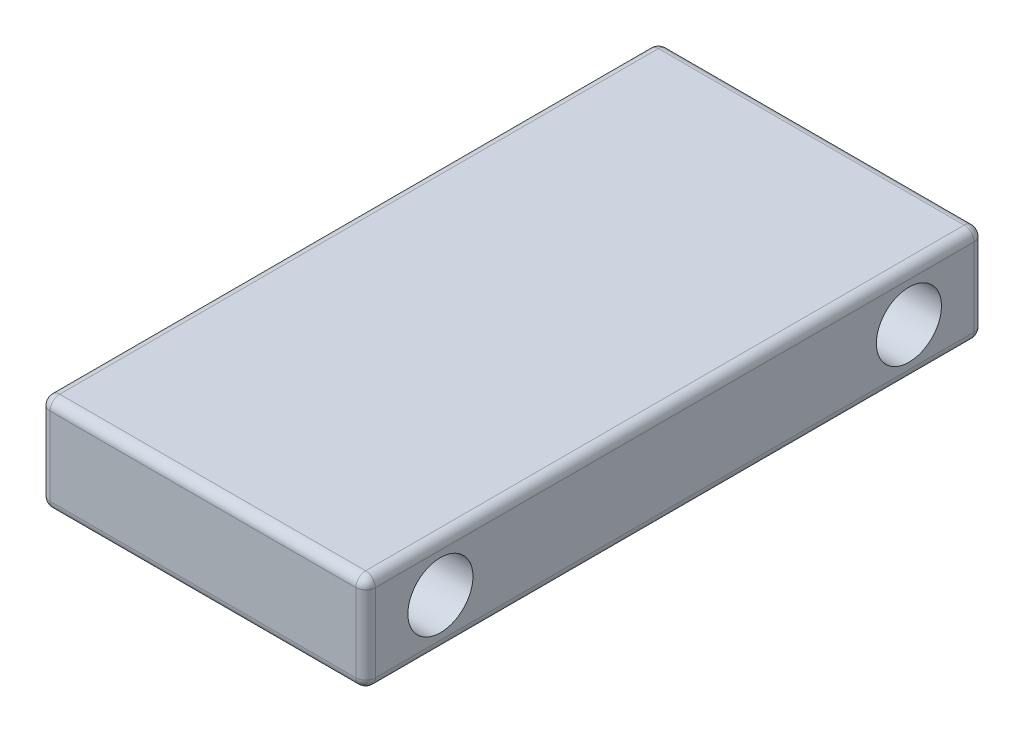
ISO-10303-21;
HEADER;
FILE_DESCRIPTION(('STEP AP214'),'2;1');
FILE_NAME('part.step','',(''),(''),'','','');
FILE_SCHEMA(('AUTOMOTIVE_DESIGN { 1 0 10303 214 1 1 1 1 }'));
ENDSEC;
DATA;
#1=APPLICATION_CONTEXT('core data for automotive mechanical design processes');
#2=APPLICATION_PROTOCOL_DEFINITION('international standard','automotive_design',2000,#1);
#3=PRODUCT_CONTEXT('',#1,'mechanical');
#4=PRODUCT('Part','Part','',(#3));
#5=PRODUCT_RELATED_PRODUCT_CATEGORY('part','',(#4));
#6=PRODUCT_DEFINITION_FORMATION('','',#4);
#7=PRODUCT_DEFINITION_CONTEXT('part definition',#1,'design');
#8=PRODUCT_DEFINITION('design','',#6,#7);
#9=PRODUCT_DEFINITION_SHAPE('','',#8);
#10=(LENGTH_UNIT() NAMED_UNIT(*) SI_UNIT(.MILLI.,.METRE.));
#11=(NAMED_UNIT(*) PLANE_ANGLE_UNIT() SI_UNIT($,.RADIAN.));
#12=(NAMED_UNIT(*) SI_UNIT($,.STERADIAN.) SOLID_ANGLE_UNIT());
#13=UNCERTAINTY_MEASURE_WITH_UNIT(LENGTH_MEASURE(1.E-05),#10,'distance_accuracy_value','');
#14=(GEOMETRIC_REPRESENTATION_CONTEXT(3) GLOBAL_UNCERTAINTY_ASSIGNED_CONTEXT((#13)) GLOBAL_UNIT_ASSIGNED_CONTEXT((#10,
#11,#12)) REPRESENTATION_CONTEXT('',''));
#15=CARTESIAN_POINT('',(0.,0.,0.));
#16=DIRECTION('',(0.,0.,1.));
#17=DIRECTION('',(1.,0.,0.));
#18=AXIS2_PLACEMENT_3D('',#15,#16,#17);
#19=CARTESIAN_POINT('',(254.,152.4,-482.6));
#20=DIRECTION('',(-1.,0.,0.));
#21=DIRECTION('',(0.,0.,1.));
#22=AXIS2_PLACEMENT_3D('',#19,#20,#21);
#23=PLANE('',#22);
#24=CARTESIAN_POINT('',(254.,76.2,-365.76));
#25=DIRECTION('',(-1.,0.,0.));
#26=DIRECTION('',(0.,0.,1.));
#27=AXIS2_PLACEMENT_3D('',#24,#25,#26);
#28=CIRCLE('',#27,50.8);
#29=CARTESIAN_POINT('',(254.,76.2,-314.96));
#30=VERTEX_POINT('',#29);
#31=EDGE_CURVE('E204',#30,#30,#28,.T.);
#32=ORIENTED_EDGE('',*,*,#31,.T.);
#33=EDGE_LOOP('',(#32));
#34=FACE_BOUND('',#33,.T.);
#35=CARTESIAN_POINT('',(254.,76.2,365.76));
#36=DIRECTION('',(-1.,0.,0.));
#37=DIRECTION('',(0.,0.,-1.));
#38=AXIS2_PLACEMENT_3D('',#35,#36,#37);
#39=CIRCLE('',#38,50.8);
#40=CARTESIAN_POINT('',(254.,76.2,314.96));
#41=VERTEX_POINT('',#40);
#42=EDGE_CURVE('E324',#41,#41,#39,.T.);
#43=ORIENTED_EDGE('',*,*,#42,.T.);
#44=EDGE_LOOP('',(#43));
#45=FACE_BOUND('',#44,.T.);
#46=DIRECTION('',(0.,0.,-1.));
#47=VECTOR('',#46,1.);
#48=CARTESIAN_POINT('',(254.,137.16,482.6));
#49=LINE('',#48,#47);
#50=CARTESIAN_POINT('',(254.,137.16,-467.36));
#51=VERTEX_POINT('',#50);
#52=CARTESIAN_POINT('',(254.,137.16,467.36));
#53=VERTEX_POINT('',#52);
#54=EDGE_CURVE('E136',#51,#53,#49,.F.);
#55=ORIENTED_EDGE('',*,*,#54,.T.);
#56=DIRECTION('',(0.,-1.,0.));
#57=VECTOR('',#56,1.);
#58=CARTESIAN_POINT('',(254.,152.4,467.36));
#59=LINE('',#58,#57);
#60=CARTESIAN_POINT('',(254.,15.24,467.36));
#61=VERTEX_POINT('',#60);
#62=EDGE_CURVE('E175',#53,#61,#59,.T.);
#63=ORIENTED_EDGE('',*,*,#62,.T.);
#64=DIRECTION('',(0.,0.,-1.));
#65=VECTOR('',#64,1.);
#66=CARTESIAN_POINT('',(254.,15.24,-482.6));
#67=LINE('',#66,#65);
#68=CARTESIAN_POINT('',(254.,15.24,-467.36));
#69=VERTEX_POINT('',#68);
#70=EDGE_CURVE('E173',#61,#69,#67,.T.);
#71=ORIENTED_EDGE('',*,*,#70,.T.);
#72=DIRECTION('',(0.,-1.,0.));
#73=VECTOR('',#72,1.);
#74=CARTESIAN_POINT('',(254.,152.4,-467.36));
#75=LINE('',#74,#73);
#76=EDGE_CURVE('E141',#69,#51,#75,.F.);
#77=ORIENTED_EDGE('',*,*,#76,.T.);
#78=EDGE_LOOP('',(#55,#63,#71,#77));
#79=FACE_BOUND('',#78,.T.);
#80=ADVANCED_FACE('F40',(#34,#45,#79),#23,.F.);
#81=CARTESIAN_POINT('',(-254.,152.4,-482.6));
#82=DIRECTION('',(0.,0.,1.));
#83=DIRECTION('',(1.,0.,0.));
#84=AXIS2_PLACEMENT_3D('',#81,#82,#83);
#85=PLANE('',#84);
#86=DIRECTION('',(-1.,0.,0.));
#87=VECTOR('',#86,1.);
#88=CARTESIAN_POINT('',(-254.,15.24,-482.6));
#89=LINE('',#88,#87);
#90=CARTESIAN_POINT('',(238.76,15.24,-482.6));
#91=VERTEX_POINT('',#90);
#92=CARTESIAN_POINT('',(-238.76,15.24,-482.6));
#93=VERTEX_POINT('',#92);
#94=EDGE_CURVE('E185',#91,#93,#89,.T.);
#95=ORIENTED_EDGE('',*,*,#94,.T.);
#96=DIRECTION('',(0.,-1.,0.));
#97=VECTOR('',#96,1.);
#98=CARTESIAN_POINT('',(-238.76,152.4,-482.6));
#99=LINE('',#98,#97);
#100=CARTESIAN_POINT('',(-238.76,137.16,-482.6));
#101=VERTEX_POINT('',#100);
#102=EDGE_CURVE('E187',#93,#101,#99,.F.);
#103=ORIENTED_EDGE('',*,*,#102,.T.);
#104=DIRECTION('',(-1.,0.,0.));
#105=VECTOR('',#104,1.);
#106=CARTESIAN_POINT('',(254.,137.16,-482.6));
#107=LINE('',#106,#105);
#108=CARTESIAN_POINT('',(238.76,137.16,-482.6));
#109=VERTEX_POINT('',#108);
#110=EDGE_CURVE('E255',#101,#109,#107,.F.);
#111=ORIENTED_EDGE('',*,*,#110,.T.);
#112=DIRECTION('',(0.,-1.,0.));
#113=VECTOR('',#112,1.);
#114=CARTESIAN_POINT('',(238.76,152.4,-482.6));
#115=LINE('',#114,#113);
#116=EDGE_CURVE('E183',#109,#91,#115,.T.);
#117=ORIENTED_EDGE('',*,*,#116,.T.);
#118=EDGE_LOOP('',(#95,#103,#111,#117));
#119=FACE_BOUND('',#118,.T.);
#120=ADVANCED_FACE('F252',(#119),#85,.F.);
#121=CARTESIAN_POINT('',(-254.,152.4,-482.6));
#122=DIRECTION('',(1.,0.,0.));
#123=DIRECTION('',(0.,0.,-1.));
#124=AXIS2_PLACEMENT_3D('',#121,#122,#123);
#125=PLANE('',#124);
#126=CARTESIAN_POINT('',(-254.,76.2,-365.76));
#127=DIRECTION('',(-1.,0.,0.));
#128=DIRECTION('',(0.,0.,1.));
#129=AXIS2_PLACEMENT_3D('',#126,#127,#128);
#130=CIRCLE('',#129,50.8);
#131=CARTESIAN_POINT('',(-254.,76.2,-314.96));
#132=VERTEX_POINT('',#131);
#133=EDGE_CURVE('E327',#132,#132,#130,.T.);
#134=ORIENTED_EDGE('',*,*,#133,.F.);
#135=EDGE_LOOP('',(#134));
#136=FACE_BOUND('',#135,.T.);
#137=CARTESIAN_POINT('',(-254.,76.2,365.76));
#138=DIRECTION('',(-1.,0.,0.));
#139=DIRECTION('',(0.,0.,-1.));
#140=AXIS2_PLACEMENT_3D('',#137,#138,#139);
#141=CIRCLE('',#140,50.8);
#142=CARTESIAN_POINT('',(-254.,76.2,314.96));
#143=VERTEX_POINT('',#142);
#144=EDGE_CURVE('E321',#143,#143,#141,.T.);
#145=ORIENTED_EDGE('',*,*,#144,.F.);
#146=EDGE_LOOP('',(#145));
#147=FACE_BOUND('',#146,.T.);
#148=DIRECTION('',(0.,0.,1.));
#149=VECTOR('',#148,1.);
#150=CARTESIAN_POINT('',(-254.,15.24,-482.6));
#151=LINE('',#150,#149);
#152=CARTESIAN_POINT('',(-254.,15.24,-467.36));
#153=VERTEX_POINT('',#152);
#154=CARTESIAN_POINT('',(-254.,15.24,467.36));
#155=VERTEX_POINT('',#154);
#156=EDGE_CURVE('E49',#153,#155,#151,.T.);
#157=ORIENTED_EDGE('',*,*,#156,.T.);
#158=DIRECTION('',(0.,-1.,0.));
#159=VECTOR('',#158,1.);
#160=CARTESIAN_POINT('',(-254.,152.4,467.36));
#161=LINE('',#160,#159);
#162=CARTESIAN_POINT('',(-254.,137.16,467.36));
#163=VERTEX_POINT('',#162);
#164=EDGE_CURVE('E11',#155,#163,#161,.F.);
#165=ORIENTED_EDGE('',*,*,#164,.T.);
#166=DIRECTION('',(0.,0.,1.));
#167=VECTOR('',#166,1.);
#168=CARTESIAN_POINT('',(-254.,137.16,-482.6));
#169=LINE('',#168,#167);
#170=CARTESIAN_POINT('',(-254.,137.16,-467.36));
#171=VERTEX_POINT('',#170);
#172=EDGE_CURVE('E311',#163,#171,#169,.F.);
#173=ORIENTED_EDGE('',*,*,#172,.T.);
#174=DIRECTION('',(0.,-1.,0.));
#175=VECTOR('',#174,1.);
#176=CARTESIAN_POINT('',(-254.,152.4,-467.36));
#177=LINE('',#176,#175);
#178=EDGE_CURVE('E60',#171,#153,#177,.T.);
#179=ORIENTED_EDGE('',*,*,#178,.T.);
#180=EDGE_LOOP('',(#157,#165,#173,#179));
#181=FACE_BOUND('',#180,.T.);
#182=ADVANCED_FACE('F310',(#136,#147,#181),#125,.F.);
#183=CARTESIAN_POINT('',(-254.,152.4,482.6));
#184=DIRECTION('',(0.,0.,-1.));
#185=DIRECTION('',(-1.,0.,0.));
#186=AXIS2_PLACEMENT_3D('',#183,#184,#185);
#187=PLANE('',#186);
#188=DIRECTION('',(1.,0.,0.));
#189=VECTOR('',#188,1.);
#190=CARTESIAN_POINT('',(-254.,15.24,482.6));
#191=LINE('',#190,#189);
#192=CARTESIAN_POINT('',(-238.76,15.24,482.6));
#193=VERTEX_POINT('',#192);
#194=CARTESIAN_POINT('',(238.76,15.24,482.6));
#195=VERTEX_POINT('',#194);
#196=EDGE_CURVE('E179',#193,#195,#191,.T.);
#197=ORIENTED_EDGE('',*,*,#196,.T.);
#198=DIRECTION('',(0.,-1.,0.));
#199=VECTOR('',#198,1.);
#200=CARTESIAN_POINT('',(238.76,152.4,482.6));
#201=LINE('',#200,#199);
#202=CARTESIAN_POINT('',(238.76,137.16,482.6));
#203=VERTEX_POINT('',#202);
#204=EDGE_CURVE('E181',#195,#203,#201,.F.);
#205=ORIENTED_EDGE('',*,*,#204,.T.);
#206=DIRECTION('',(1.,0.,0.));
#207=VECTOR('',#206,1.);
#208=CARTESIAN_POINT('',(-254.,137.16,482.6));
#209=LINE('',#208,#207);
#210=CARTESIAN_POINT('',(-238.76,137.16,482.6));
#211=VERTEX_POINT('',#210);
#212=EDGE_CURVE('E260',#203,#211,#209,.F.);
#213=ORIENTED_EDGE('',*,*,#212,.T.);
#214=DIRECTION('',(0.,-1.,0.));
#215=VECTOR('',#214,1.);
#216=CARTESIAN_POINT('',(-238.76,152.4,482.6));
#217=LINE('',#216,#215);
#218=EDGE_CURVE('E177',#211,#193,#217,.T.);
#219=ORIENTED_EDGE('',*,*,#218,.T.);
#220=EDGE_LOOP('',(#197,#205,#213,#219));
#221=FACE_BOUND('',#220,.T.);
#222=ADVANCED_FACE('F344',(#221),#187,.F.);
#223=CARTESIAN_POINT('',(0.,152.4,0.));
#224=DIRECTION('',(0.,1.,0.));
#225=DIRECTION('',(0.,0.,1.));
#226=AXIS2_PLACEMENT_3D('',#223,#224,#225);
#227=PLANE('',#226);
#228=DIRECTION('',(-1.,0.,0.));
#229=VECTOR('',#228,1.);
#230=CARTESIAN_POINT('',(-254.,152.4,-467.36));
#231=LINE('',#230,#229);
#232=CARTESIAN_POINT('',(238.76,152.4,-467.36));
#233=VERTEX_POINT('',#232);
#234=CARTESIAN_POINT('',(-238.76,152.4,-467.36));
#235=VERTEX_POINT('',#234);
#236=EDGE_CURVE('E150',#233,#235,#231,.T.);
#237=ORIENTED_EDGE('',*,*,#236,.T.);
#238=DIRECTION('',(0.,0.,1.));
#239=VECTOR('',#238,1.);
#240=CARTESIAN_POINT('',(-238.76,152.4,482.6));
#241=LINE('',#240,#239);
#242=CARTESIAN_POINT('',(-238.76,152.4,467.36));
#243=VERTEX_POINT('',#242);
#244=EDGE_CURVE('E316',#235,#243,#241,.T.);
#245=ORIENTED_EDGE('',*,*,#244,.T.);
#246=DIRECTION('',(1.,0.,0.));
#247=VECTOR('',#246,1.);
#248=CARTESIAN_POINT('',(254.,152.4,467.36));
#249=LINE('',#248,#247);
#250=CARTESIAN_POINT('',(238.76,152.4,467.36));
#251=VERTEX_POINT('',#250);
#252=EDGE_CURVE('E153',#243,#251,#249,.T.);
#253=ORIENTED_EDGE('',*,*,#252,.T.);
#254=DIRECTION('',(0.,0.,-1.));
#255=VECTOR('',#254,1.);
#256=CARTESIAN_POINT('',(238.76,152.4,-482.6));
#257=LINE('',#256,#255);
#258=EDGE_CURVE('E133',#251,#233,#257,.T.);
#259=ORIENTED_EDGE('',*,*,#258,.T.);
#260=EDGE_LOOP('',(#237,#245,#253,#259));
#261=FACE_BOUND('',#260,.T.);
#262=ADVANCED_FACE('F148',(#261),#227,.T.);
#263=CARTESIAN_POINT('',(0.,0.,0.));
#264=DIRECTION('',(0.,1.,0.));
#265=DIRECTION('',(0.,0.,1.));
#266=AXIS2_PLACEMENT_3D('',#263,#264,#265);
#267=PLANE('',#266);
#268=DIRECTION('',(0.,0.,1.));
#269=VECTOR('',#268,1.);
#270=CARTESIAN_POINT('',(-238.76,0.,0.));
#271=LINE('',#270,#269);
#272=CARTESIAN_POINT('',(-238.76,0.,467.36));
#273=VERTEX_POINT('',#272);
#274=CARTESIAN_POINT('',(-238.76,0.,-467.36));
#275=VERTEX_POINT('',#274);
#276=EDGE_CURVE('E193',#273,#275,#271,.F.);
#277=ORIENTED_EDGE('',*,*,#276,.T.);
#278=DIRECTION('',(-1.,0.,0.));
#279=VECTOR('',#278,1.);
#280=CARTESIAN_POINT('',(-1.02140518265514E-13,0.,-467.36));
#281=LINE('',#280,#279);
#282=CARTESIAN_POINT('',(238.76,0.,-467.36));
#283=VERTEX_POINT('',#282);
#284=EDGE_CURVE('E195',#275,#283,#281,.F.);
#285=ORIENTED_EDGE('',*,*,#284,.T.);
#286=DIRECTION('',(0.,0.,-1.));
#287=VECTOR('',#286,1.);
#288=CARTESIAN_POINT('',(238.76,0.,0.));
#289=LINE('',#288,#287);
#290=CARTESIAN_POINT('',(238.76,0.,467.36));
#291=VERTEX_POINT('',#290);
#292=EDGE_CURVE('E189',#283,#291,#289,.F.);
#293=ORIENTED_EDGE('',*,*,#292,.T.);
#294=DIRECTION('',(1.,0.,0.));
#295=VECTOR('',#294,1.);
#296=CARTESIAN_POINT('',(1.02140518265514E-13,0.,467.36));
#297=LINE('',#296,#295);
#298=EDGE_CURVE('E191',#291,#273,#297,.F.);
#299=ORIENTED_EDGE('',*,*,#298,.T.);
#300=EDGE_LOOP('',(#277,#285,#293,#299));
#301=FACE_BOUND('',#300,.T.);
#302=ADVANCED_FACE('F290',(#301),#267,.F.);
#303=CARTESIAN_POINT('',(238.76,137.16,0.));
#304=DIRECTION('',(0.,0.,1.));
#305=DIRECTION('',(1.,0.,0.));
#306=AXIS2_PLACEMENT_3D('',#303,#304,#305);
#307=CYLINDRICAL_SURFACE('',#306,15.24);
#308=ORIENTED_EDGE('',*,*,#54,.F.);
#309=CARTESIAN_POINT('',(238.76,137.16,-467.36));
#310=DIRECTION('',(0.,0.,1.));
#311=DIRECTION('',(1.,0.,0.));
#312=AXIS2_PLACEMENT_3D('',#309,#310,#311);
#313=CIRCLE('',#312,15.24);
#314=EDGE_CURVE('E130',#51,#233,#313,.T.);
#315=ORIENTED_EDGE('',*,*,#314,.T.);
#316=ORIENTED_EDGE('',*,*,#258,.F.);
#317=CARTESIAN_POINT('',(238.76,137.16,467.36));
#318=DIRECTION('',(0.,0.,1.));
#319=DIRECTION('',(1.,0.,0.));
#320=AXIS2_PLACEMENT_3D('',#317,#318,#319);
#321=CIRCLE('',#320,15.24);
#322=EDGE_CURVE('E142',#251,#53,#321,.F.);
#323=ORIENTED_EDGE('',*,*,#322,.T.);
#324=EDGE_LOOP('',(#308,#315,#316,#323));
#325=FACE_BOUND('',#324,.T.);
#326=ADVANCED_FACE('F132',(#325),#307,.T.);
#327=CARTESIAN_POINT('',(-1.02140518265514E-13,137.16,-467.36));
#328=DIRECTION('',(1.,0.,0.));
#329=DIRECTION('',(0.,0.,-1.));
#330=AXIS2_PLACEMENT_3D('',#327,#328,#329);
#331=CYLINDRICAL_SURFACE('',#330,15.24);
#332=ORIENTED_EDGE('',*,*,#110,.F.);
#333=CARTESIAN_POINT('',(-238.76,137.16,-467.36));
#334=DIRECTION('',(1.,0.,0.));
#335=DIRECTION('',(0.,0.,-1.));
#336=AXIS2_PLACEMENT_3D('',#333,#334,#335);
#337=CIRCLE('',#336,15.24);
#338=EDGE_CURVE('E161',#101,#235,#337,.T.);
#339=ORIENTED_EDGE('',*,*,#338,.T.);
#340=ORIENTED_EDGE('',*,*,#236,.F.);
#341=CARTESIAN_POINT('',(238.76,137.16,-467.36));
#342=DIRECTION('',(1.,0.,0.));
#343=DIRECTION('',(0.,0.,-1.));
#344=AXIS2_PLACEMENT_3D('',#341,#342,#343);
#345=CIRCLE('',#344,15.24);
#346=EDGE_CURVE('E158',#233,#109,#345,.F.);
#347=ORIENTED_EDGE('',*,*,#346,.T.);
#348=EDGE_LOOP('',(#332,#339,#340,#347));
#349=FACE_BOUND('',#348,.T.);
#350=ADVANCED_FACE('F157',(#349),#331,.T.);
#351=CARTESIAN_POINT('',(1.02140518265514E-13,137.16,467.36));
#352=DIRECTION('',(-1.,0.,0.));
#353=DIRECTION('',(0.,0.,1.));
#354=AXIS2_PLACEMENT_3D('',#351,#352,#353);
#355=CYLINDRICAL_SURFACE('',#354,15.24);
#356=ORIENTED_EDGE('',*,*,#252,.F.);
#357=CARTESIAN_POINT('',(-238.76,137.16,467.36));
#358=DIRECTION('',(-1.,0.,0.));
#359=DIRECTION('',(0.,0.,1.));
#360=AXIS2_PLACEMENT_3D('',#357,#358,#359);
#361=CIRCLE('',#360,15.24);
#362=EDGE_CURVE('E164',#243,#211,#361,.F.);
#363=ORIENTED_EDGE('',*,*,#362,.T.);
#364=ORIENTED_EDGE('',*,*,#212,.F.);
#365=CARTESIAN_POINT('',(238.76,137.16,467.36));
#366=DIRECTION('',(-1.,0.,0.));
#367=DIRECTION('',(0.,0.,1.));
#368=AXIS2_PLACEMENT_3D('',#365,#366,#367);
#369=CIRCLE('',#368,15.24);
#370=EDGE_CURVE('E167',#203,#251,#369,.T.);
#371=ORIENTED_EDGE('',*,*,#370,.T.);
#372=EDGE_LOOP('',(#356,#363,#364,#371));
#373=FACE_BOUND('',#372,.T.);
#374=ADVANCED_FACE('F268',(#373),#355,.T.);
#375=CARTESIAN_POINT('',(-238.76,137.16,0.));
#376=DIRECTION('',(0.,0.,-1.));
#377=DIRECTION('',(-1.,0.,0.));
#378=AXIS2_PLACEMENT_3D('',#375,#376,#377);
#379=CYLINDRICAL_SURFACE('',#378,15.24);
#380=ORIENTED_EDGE('',*,*,#172,.F.);
#381=CARTESIAN_POINT('',(-238.76,137.16,467.36));
#382=DIRECTION('',(0.,0.,-1.));
#383=DIRECTION('',(-1.,0.,0.));
#384=AXIS2_PLACEMENT_3D('',#381,#382,#383);
#385=CIRCLE('',#384,15.24);
#386=EDGE_CURVE('E258',#163,#243,#385,.T.);
#387=ORIENTED_EDGE('',*,*,#386,.T.);
#388=ORIENTED_EDGE('',*,*,#244,.F.);
#389=CARTESIAN_POINT('',(-238.76,137.16,-467.36));
#390=DIRECTION('',(0.,0.,-1.));
#391=DIRECTION('',(-1.,0.,0.));
#392=AXIS2_PLACEMENT_3D('',#389,#390,#391);
#393=CIRCLE('',#392,15.24);
#394=EDGE_CURVE('E256',#235,#171,#393,.F.);
#395=ORIENTED_EDGE('',*,*,#394,.T.);
#396=EDGE_LOOP('',(#380,#387,#388,#395));
#397=FACE_BOUND('',#396,.T.);
#398=ADVANCED_FACE('F314',(#397),#379,.T.);
#399=CARTESIAN_POINT('',(238.76,137.16,-467.36));
#400=DIRECTION('',(0.,0.,1.));
#401=DIRECTION('',(1.,0.,0.));
#402=AXIS2_PLACEMENT_3D('',#399,#400,#401);
#403=SPHERICAL_SURFACE('',#402,15.24);
#404=ORIENTED_EDGE('',*,*,#346,.F.);
#405=ORIENTED_EDGE('',*,*,#314,.F.);
#406=CARTESIAN_POINT('',(238.76,137.16,-467.36));
#407=DIRECTION('',(0.,-1.,0.));
#408=DIRECTION('',(0.,0.,-1.));
#409=AXIS2_PLACEMENT_3D('',#406,#407,#408);
#410=CIRCLE('',#409,15.24);
#411=EDGE_CURVE('E44',#109,#51,#410,.T.);
#412=ORIENTED_EDGE('',*,*,#411,.F.);
#413=EDGE_LOOP('',(#404,#405,#412));
#414=FACE_BOUND('',#413,.T.);
#415=ADVANCED_FACE('F42',(#414),#403,.T.);
#416=CARTESIAN_POINT('',(238.76,152.4,-467.36));
#417=DIRECTION('',(0.,-1.,0.));
#418=DIRECTION('',(0.,0.,-1.));
#419=AXIS2_PLACEMENT_3D('',#416,#417,#418);
#420=CYLINDRICAL_SURFACE('',#419,15.24);
#421=ORIENTED_EDGE('',*,*,#411,.T.);
#422=ORIENTED_EDGE('',*,*,#76,.F.);
#423=CARTESIAN_POINT('',(238.76,15.24,-467.36));
#424=DIRECTION('',(0.,-1.,0.));
#425=DIRECTION('',(0.,0.,-1.));
#426=AXIS2_PLACEMENT_3D('',#423,#424,#425);
#427=CIRCLE('',#426,15.24);
#428=EDGE_CURVE('E242',#91,#69,#427,.T.);
#429=ORIENTED_EDGE('',*,*,#428,.F.);
#430=ORIENTED_EDGE('',*,*,#116,.F.);
#431=EDGE_LOOP('',(#421,#422,#429,#430));
#432=FACE_BOUND('',#431,.T.);
#433=ADVANCED_FACE('F250',(#432),#420,.T.);
#434=CARTESIAN_POINT('',(238.76,137.16,467.36));
#435=DIRECTION('',(0.,0.,1.));
#436=DIRECTION('',(1.,0.,0.));
#437=AXIS2_PLACEMENT_3D('',#434,#435,#436);
#438=SPHERICAL_SURFACE('',#437,15.24);
#439=ORIENTED_EDGE('',*,*,#322,.F.);
#440=ORIENTED_EDGE('',*,*,#370,.F.);
#441=CARTESIAN_POINT('',(238.76,137.16,467.36));
#442=DIRECTION('',(0.,-1.,0.));
#443=DIRECTION('',(0.,0.,-1.));
#444=AXIS2_PLACEMENT_3D('',#441,#442,#443);
#445=CIRCLE('',#444,15.24);
#446=EDGE_CURVE('E240',#53,#203,#445,.T.);
#447=ORIENTED_EDGE('',*,*,#446,.F.);
#448=EDGE_LOOP('',(#439,#440,#447));
#449=FACE_BOUND('',#448,.T.);
#450=ADVANCED_FACE('F272',(#449),#438,.T.);
#451=CARTESIAN_POINT('',(238.76,15.24,-467.36));
#452=DIRECTION('',(1.,0.,0.));
#453=DIRECTION('',(0.,1.,0.));
#454=AXIS2_PLACEMENT_3D('',#451,#452,#453);
#455=SPHERICAL_SURFACE('',#454,15.24);
#456=CARTESIAN_POINT('',(238.76,15.24,-467.36));
#457=DIRECTION('',(1.,0.,0.));
#458=DIRECTION('',(0.,0.,-1.));
#459=AXIS2_PLACEMENT_3D('',#456,#457,#458);
#460=CIRCLE('',#459,15.24);
#461=EDGE_CURVE('E234',#91,#283,#460,.F.);
#462=ORIENTED_EDGE('',*,*,#461,.F.);
#463=ORIENTED_EDGE('',*,*,#428,.T.);
#464=CARTESIAN_POINT('',(238.76,15.24,-467.36));
#465=DIRECTION('',(0.,0.,-1.));
#466=DIRECTION('',(-1.,0.,0.));
#467=AXIS2_PLACEMENT_3D('',#464,#465,#466);
#468=CIRCLE('',#467,15.24);
#469=EDGE_CURVE('E237',#283,#69,#468,.F.);
#470=ORIENTED_EDGE('',*,*,#469,.F.);
#471=EDGE_LOOP('',(#462,#463,#470));
#472=FACE_BOUND('',#471,.T.);
#473=ADVANCED_FACE('F284',(#472),#455,.T.);
#474=CARTESIAN_POINT('',(-238.76,137.16,-467.36));
#475=DIRECTION('',(0.,0.,1.));
#476=DIRECTION('',(1.,0.,0.));
#477=AXIS2_PLACEMENT_3D('',#474,#475,#476);
#478=SPHERICAL_SURFACE('',#477,15.24);
#479=ORIENTED_EDGE('',*,*,#394,.F.);
#480=ORIENTED_EDGE('',*,*,#338,.F.);
#481=CARTESIAN_POINT('',(-238.76,137.16,-467.36));
#482=DIRECTION('',(0.,-1.,0.));
#483=DIRECTION('',(0.,0.,-1.));
#484=AXIS2_PLACEMENT_3D('',#481,#482,#483);
#485=CIRCLE('',#484,15.24);
#486=EDGE_CURVE('E231',#171,#101,#485,.T.);
#487=ORIENTED_EDGE('',*,*,#486,.F.);
#488=EDGE_LOOP('',(#479,#480,#487));
#489=FACE_BOUND('',#488,.T.);
#490=ADVANCED_FACE('F400',(#489),#478,.T.);
#491=CARTESIAN_POINT('',(238.76,152.4,467.36));
#492=DIRECTION('',(0.,-1.,0.));
#493=DIRECTION('',(0.,0.,-1.));
#494=AXIS2_PLACEMENT_3D('',#491,#492,#493);
#495=CYLINDRICAL_SURFACE('',#494,15.24);
#496=ORIENTED_EDGE('',*,*,#446,.T.);
#497=ORIENTED_EDGE('',*,*,#204,.F.);
#498=CARTESIAN_POINT('',(238.76,15.24,467.36));
#499=DIRECTION('',(0.,-1.,0.));
#500=DIRECTION('',(0.,0.,-1.));
#501=AXIS2_PLACEMENT_3D('',#498,#499,#500);
#502=CIRCLE('',#501,15.24);
#503=EDGE_CURVE('E228',#61,#195,#502,.T.);
#504=ORIENTED_EDGE('',*,*,#503,.F.);
#505=ORIENTED_EDGE('',*,*,#62,.F.);
#506=EDGE_LOOP('',(#496,#497,#504,#505));
#507=FACE_BOUND('',#506,.T.);
#508=ADVANCED_FACE('F276',(#507),#495,.T.);
#509=CARTESIAN_POINT('',(238.76,15.24,-482.6));
#510=DIRECTION('',(0.,0.,-1.));
#511=DIRECTION('',(-1.,0.,0.));
#512=AXIS2_PLACEMENT_3D('',#509,#510,#511);
#513=CYLINDRICAL_SURFACE('',#512,15.24);
#514=ORIENTED_EDGE('',*,*,#469,.T.);
#515=ORIENTED_EDGE('',*,*,#70,.F.);
#516=CARTESIAN_POINT('',(238.76,15.24,467.36));
#517=DIRECTION('',(0.,0.,1.));
#518=DIRECTION('',(1.,0.,0.));
#519=AXIS2_PLACEMENT_3D('',#516,#517,#518);
#520=CIRCLE('',#519,15.24);
#521=EDGE_CURVE('E225',#291,#61,#520,.T.);
#522=ORIENTED_EDGE('',*,*,#521,.F.);
#523=ORIENTED_EDGE('',*,*,#292,.F.);
#524=EDGE_LOOP('',(#514,#515,#522,#523));
#525=FACE_BOUND('',#524,.T.);
#526=ADVANCED_FACE('F282',(#525),#513,.T.);
#527=CARTESIAN_POINT('',(-254.,15.24,-467.36));
#528=DIRECTION('',(-1.,0.,0.));
#529=DIRECTION('',(0.,0.,1.));
#530=AXIS2_PLACEMENT_3D('',#527,#528,#529);
#531=CYLINDRICAL_SURFACE('',#530,15.24);
#532=ORIENTED_EDGE('',*,*,#461,.T.);
#533=ORIENTED_EDGE('',*,*,#284,.F.);
#534=CARTESIAN_POINT('',(-238.76,15.24,-467.36));
#535=DIRECTION('',(-1.,0.,0.));
#536=DIRECTION('',(0.,0.,1.));
#537=AXIS2_PLACEMENT_3D('',#534,#535,#536);
#538=CIRCLE('',#537,15.24);
#539=EDGE_CURVE('E222',#93,#275,#538,.T.);
#540=ORIENTED_EDGE('',*,*,#539,.F.);
#541=ORIENTED_EDGE('',*,*,#94,.F.);
#542=EDGE_LOOP('',(#532,#533,#540,#541));
#543=FACE_BOUND('',#542,.T.);
#544=ADVANCED_FACE('F287',(#543),#531,.T.);
#545=CARTESIAN_POINT('',(-238.76,152.4,-467.36));
#546=DIRECTION('',(0.,-1.,0.));
#547=DIRECTION('',(0.,0.,-1.));
#548=AXIS2_PLACEMENT_3D('',#545,#546,#547);
#549=CYLINDRICAL_SURFACE('',#548,15.24);
#550=ORIENTED_EDGE('',*,*,#486,.T.);
#551=ORIENTED_EDGE('',*,*,#102,.F.);
#552=CARTESIAN_POINT('',(-238.76,15.24,-467.36));
#553=DIRECTION('',(0.,-1.,0.));
#554=DIRECTION('',(0.,0.,-1.));
#555=AXIS2_PLACEMENT_3D('',#552,#553,#554);
#556=CIRCLE('',#555,15.24);
#557=EDGE_CURVE('E219',#153,#93,#556,.T.);
#558=ORIENTED_EDGE('',*,*,#557,.F.);
#559=ORIENTED_EDGE('',*,*,#178,.F.);
#560=EDGE_LOOP('',(#550,#551,#558,#559));
#561=FACE_BOUND('',#560,.T.);
#562=ADVANCED_FACE('F389',(#561),#549,.T.);
#563=CARTESIAN_POINT('',(238.76,15.24,467.36));
#564=DIRECTION('',(1.,0.,0.));
#565=DIRECTION('',(0.,0.,-1.));
#566=AXIS2_PLACEMENT_3D('',#563,#564,#565);
#567=SPHERICAL_SURFACE('',#566,15.24);
#568=ORIENTED_EDGE('',*,*,#521,.T.);
#569=ORIENTED_EDGE('',*,*,#503,.T.);
#570=CARTESIAN_POINT('',(238.76,15.24,467.36));
#571=DIRECTION('',(1.,0.,0.));
#572=DIRECTION('',(0.,0.,-1.));
#573=AXIS2_PLACEMENT_3D('',#570,#571,#572);
#574=CIRCLE('',#573,15.24);
#575=EDGE_CURVE('E216',#291,#195,#574,.F.);
#576=ORIENTED_EDGE('',*,*,#575,.F.);
#577=EDGE_LOOP('',(#568,#569,#576));
#578=FACE_BOUND('',#577,.T.);
#579=ADVANCED_FACE('F385',(#578),#567,.T.);
#580=CARTESIAN_POINT('',(-238.76,15.24,-467.36));
#581=DIRECTION('',(0.,0.,-1.));
#582=DIRECTION('',(0.,1.,0.));
#583=AXIS2_PLACEMENT_3D('',#580,#581,#582);
#584=SPHERICAL_SURFACE('',#583,15.24);
#585=ORIENTED_EDGE('',*,*,#557,.T.);
#586=ORIENTED_EDGE('',*,*,#539,.T.);
#587=CARTESIAN_POINT('',(-238.76,15.24,-467.36));
#588=DIRECTION('',(0.,0.,-1.));
#589=DIRECTION('',(-1.,0.,0.));
#590=AXIS2_PLACEMENT_3D('',#587,#588,#589);
#591=CIRCLE('',#590,15.24);
#592=EDGE_CURVE('E213',#153,#275,#591,.F.);
#593=ORIENTED_EDGE('',*,*,#592,.F.);
#594=EDGE_LOOP('',(#585,#586,#593));
#595=FACE_BOUND('',#594,.T.);
#596=ADVANCED_FACE('F382',(#595),#584,.T.);
#597=CARTESIAN_POINT('',(-254.,15.24,467.36));
#598=DIRECTION('',(1.,0.,0.));
#599=DIRECTION('',(0.,0.,-1.));
#600=AXIS2_PLACEMENT_3D('',#597,#598,#599);
#601=CYLINDRICAL_SURFACE('',#600,15.24);
#602=ORIENTED_EDGE('',*,*,#575,.T.);
#603=ORIENTED_EDGE('',*,*,#196,.F.);
#604=CARTESIAN_POINT('',(-238.76,15.24,467.36));
#605=DIRECTION('',(-1.,0.,0.));
#606=DIRECTION('',(0.,0.,1.));
#607=AXIS2_PLACEMENT_3D('',#604,#605,#606);
#608=CIRCLE('',#607,15.24);
#609=EDGE_CURVE('E210',#273,#193,#608,.T.);
#610=ORIENTED_EDGE('',*,*,#609,.F.);
#611=ORIENTED_EDGE('',*,*,#298,.F.);
#612=EDGE_LOOP('',(#602,#603,#610,#611));
#613=FACE_BOUND('',#612,.T.);
#614=ADVANCED_FACE('F300',(#613),#601,.T.);
#615=CARTESIAN_POINT('',(-238.76,15.24,-482.6));
#616=DIRECTION('',(0.,0.,1.));
#617=DIRECTION('',(1.,0.,0.));
#618=AXIS2_PLACEMENT_3D('',#615,#616,#617);
#619=CYLINDRICAL_SURFACE('',#618,15.24);
#620=ORIENTED_EDGE('',*,*,#592,.T.);
#621=ORIENTED_EDGE('',*,*,#276,.F.);
#622=CARTESIAN_POINT('',(-238.76,15.24,467.36));
#623=DIRECTION('',(0.,0.,1.));
#624=DIRECTION('',(1.,0.,0.));
#625=AXIS2_PLACEMENT_3D('',#622,#623,#624);
#626=CIRCLE('',#625,15.24);
#627=EDGE_CURVE('E207',#155,#273,#626,.T.);
#628=ORIENTED_EDGE('',*,*,#627,.F.);
#629=ORIENTED_EDGE('',*,*,#156,.F.);
#630=EDGE_LOOP('',(#620,#621,#628,#629));
#631=FACE_BOUND('',#630,.T.);
#632=ADVANCED_FACE('F295',(#631),#619,.T.);
#633=CARTESIAN_POINT('',(-238.76,15.24,467.36));
#634=DIRECTION('',(0.,-1.,0.));
#635=DIRECTION('',(0.,0.,-1.));
#636=AXIS2_PLACEMENT_3D('',#633,#634,#635);
#637=SPHERICAL_SURFACE('',#636,15.24);
#638=ORIENTED_EDGE('',*,*,#627,.T.);
#639=ORIENTED_EDGE('',*,*,#609,.T.);
#640=CARTESIAN_POINT('',(-238.76,15.24,467.36));
#641=DIRECTION('',(0.,-1.,0.));
#642=DIRECTION('',(0.,0.,-1.));
#643=AXIS2_PLACEMENT_3D('',#640,#641,#642);
#644=CIRCLE('',#643,15.24);
#645=EDGE_CURVE('E203',#155,#193,#644,.F.);
#646=ORIENTED_EDGE('',*,*,#645,.F.);
#647=EDGE_LOOP('',(#638,#639,#646));
#648=FACE_BOUND('',#647,.T.);
#649=ADVANCED_FACE('F302',(#648),#637,.T.);
#650=CARTESIAN_POINT('',(-238.76,152.4,467.36));
#651=DIRECTION('',(0.,-1.,0.));
#652=DIRECTION('',(0.,0.,-1.));
#653=AXIS2_PLACEMENT_3D('',#650,#651,#652);
#654=CYLINDRICAL_SURFACE('',#653,15.24);
#655=ORIENTED_EDGE('',*,*,#645,.T.);
#656=ORIENTED_EDGE('',*,*,#218,.F.);
#657=CARTESIAN_POINT('',(-238.76,137.16,467.36));
#658=DIRECTION('',(0.,1.,0.));
#659=DIRECTION('',(0.,0.,1.));
#660=AXIS2_PLACEMENT_3D('',#657,#658,#659);
#661=CIRCLE('',#660,15.24);
#662=EDGE_CURVE('E200',#163,#211,#661,.T.);
#663=ORIENTED_EDGE('',*,*,#662,.F.);
#664=ORIENTED_EDGE('',*,*,#164,.F.);
#665=EDGE_LOOP('',(#655,#656,#663,#664));
#666=FACE_BOUND('',#665,.T.);
#667=ADVANCED_FACE('F307',(#666),#654,.T.);
#668=CARTESIAN_POINT('',(-238.76,137.16,467.36));
#669=DIRECTION('',(0.,0.,1.));
#670=DIRECTION('',(1.,0.,0.));
#671=AXIS2_PLACEMENT_3D('',#668,#669,#670);
#672=SPHERICAL_SURFACE('',#671,15.24);
#673=ORIENTED_EDGE('',*,*,#662,.T.);
#674=ORIENTED_EDGE('',*,*,#362,.F.);
#675=ORIENTED_EDGE('',*,*,#386,.F.);
#676=EDGE_LOOP('',(#673,#674,#675));
#677=FACE_BOUND('',#676,.T.);
#678=ADVANCED_FACE('F349',(#677),#672,.T.);
#679=CARTESIAN_POINT('',(254.,76.2,365.76));
#680=DIRECTION('',(-1.,0.,0.));
#681=DIRECTION('',(0.,0.,1.));
#682=AXIS2_PLACEMENT_3D('',#679,#680,#681);
#683=CYLINDRICAL_SURFACE('',#682,50.8);
#684=ORIENTED_EDGE('',*,*,#42,.F.);
#685=EDGE_LOOP('',(#684));
#686=FACE_BOUND('',#685,.T.);
#687=ORIENTED_EDGE('',*,*,#144,.T.);
#688=EDGE_LOOP('',(#687));
#689=FACE_BOUND('',#688,.T.);
#690=ADVANCED_FACE('F338',(#686,#689),#683,.F.);
#691=CARTESIAN_POINT('',(254.,76.2,-365.76));
#692=DIRECTION('',(-1.,0.,0.));
#693=DIRECTION('',(0.,0.,1.));
#694=AXIS2_PLACEMENT_3D('',#691,#692,#693);
#695=CYLINDRICAL_SURFACE('',#694,50.8);
#696=ORIENTED_EDGE('',*,*,#31,.F.);
#697=EDGE_LOOP('',(#696));
#698=FACE_BOUND('',#697,.T.);
#699=ORIENTED_EDGE('',*,*,#133,.T.);
#700=EDGE_LOOP('',(#699));
#701=FACE_BOUND('',#700,.T.);
#702=ADVANCED_FACE('F335',(#698,#701),#695,.F.);
#703=CLOSED_SHELL('',(#80,#120,#182,#222,#262,#302,#326,#350,#374,#398,#415,#433,#450,#473,#490,
#508,#526,#544,#562,#579,#596,#614,#632,#649,#667,#678,#690,#702));
#704=MANIFOLD_SOLID_BREP('B2',#703);
#705=ADVANCED_BREP_SHAPE_REPRESENTATION('',(#18,#704),#14);
#706=SHAPE_DEFINITION_REPRESENTATION(#9,#705);
ENDSEC;
END-ISO-10303-21;
